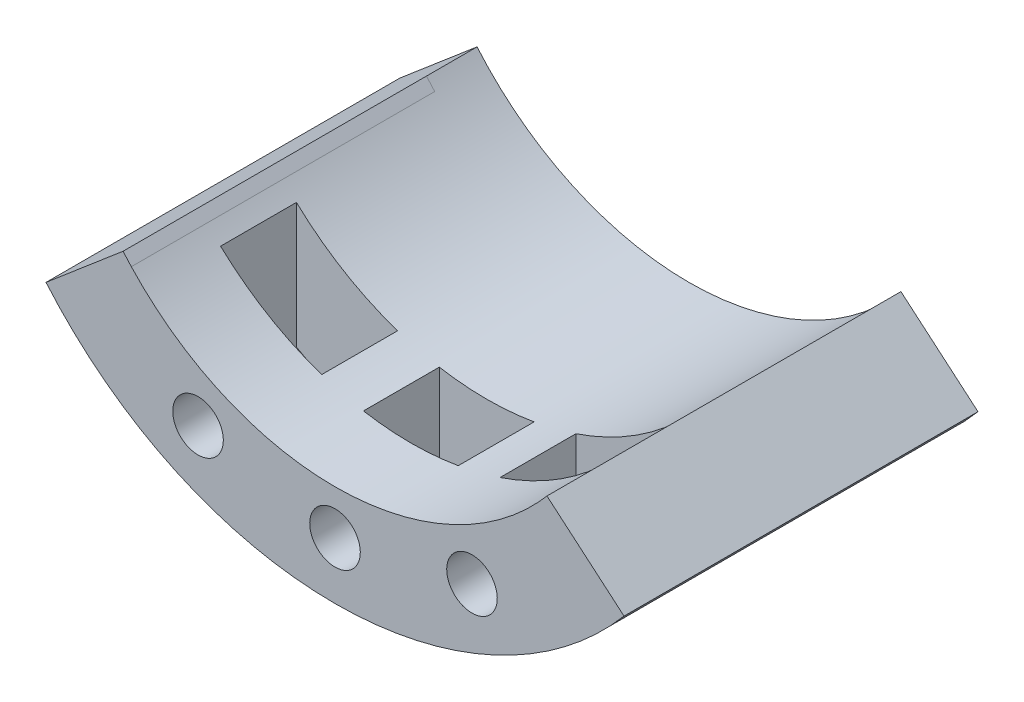
ISO-10303-21;
HEADER;
FILE_DESCRIPTION(('STEP AP214'),'2;1');
FILE_NAME('part.step','',(''),(''),'','','');
FILE_SCHEMA(('AUTOMOTIVE_DESIGN { 1 0 10303 214 1 1 1 1 }'));
ENDSEC;
DATA;
#1=APPLICATION_CONTEXT('core data for automotive mechanical design processes');
#2=APPLICATION_PROTOCOL_DEFINITION('international standard','automotive_design',2000,#1);
#3=PRODUCT_CONTEXT('',#1,'mechanical');
#4=PRODUCT('Part','Part','',(#3));
#5=PRODUCT_RELATED_PRODUCT_CATEGORY('part','',(#4));
#6=PRODUCT_DEFINITION_FORMATION('','',#4);
#7=PRODUCT_DEFINITION_CONTEXT('part definition',#1,'design');
#8=PRODUCT_DEFINITION('design','',#6,#7);
#9=PRODUCT_DEFINITION_SHAPE('','',#8);
#10=(LENGTH_UNIT() NAMED_UNIT(*) SI_UNIT(.MILLI.,.METRE.));
#11=(NAMED_UNIT(*) PLANE_ANGLE_UNIT() SI_UNIT($,.RADIAN.));
#12=(NAMED_UNIT(*) SI_UNIT($,.STERADIAN.) SOLID_ANGLE_UNIT());
#13=UNCERTAINTY_MEASURE_WITH_UNIT(LENGTH_MEASURE(1.E-05),#10,'distance_accuracy_value','');
#14=(GEOMETRIC_REPRESENTATION_CONTEXT(3) GLOBAL_UNCERTAINTY_ASSIGNED_CONTEXT((#13)) GLOBAL_UNIT_ASSIGNED_CONTEXT((#10,
#11,#12)) REPRESENTATION_CONTEXT('',''));
#15=CARTESIAN_POINT('',(0.,0.,0.));
#16=DIRECTION('',(0.,0.,1.));
#17=DIRECTION('',(1.,0.,0.));
#18=AXIS2_PLACEMENT_3D('',#15,#16,#17);
#19=CARTESIAN_POINT('',(0.,0.,4.));
#20=DIRECTION('',(0.,0.,-1.));
#21=DIRECTION('',(-1.,0.,0.));
#22=AXIS2_PLACEMENT_3D('',#19,#20,#21);
#23=CYLINDRICAL_SURFACE('',#22,30.);
#24=CARTESIAN_POINT('',(0.,0.,-6.));
#25=DIRECTION('',(0.,0.,1.));
#26=DIRECTION('',(1.,0.,0.));
#27=AXIS2_PLACEMENT_3D('',#24,#25,#26);
#28=CIRCLE('',#27,30.);
#29=CARTESIAN_POINT('',(-7.05257447191136,-29.1592385586137,-6.));
#30=VERTEX_POINT('',#29);
#31=CARTESIAN_POINT('',(-15.0525744719114,-25.9503372187639,-6.));
#32=VERTEX_POINT('',#31);
#33=EDGE_CURVE('E238',#30,#32,#28,.F.);
#34=ORIENTED_EDGE('',*,*,#33,.F.);
#35=DIRECTION('',(0.,0.,-1.));
#36=VECTOR('',#35,1.);
#37=CARTESIAN_POINT('',(-7.05257447191136,-29.1592385586137,4.));
#38=LINE('',#37,#36);
#39=CARTESIAN_POINT('',(-7.05257447191136,-29.1592385586137,-12.));
#40=VERTEX_POINT('',#39);
#41=EDGE_CURVE('E215',#40,#30,#38,.F.);
#42=ORIENTED_EDGE('',*,*,#41,.F.);
#43=CARTESIAN_POINT('',(0.,0.,-12.));
#44=DIRECTION('',(0.,0.,-1.));
#45=DIRECTION('',(-1.,0.,0.));
#46=AXIS2_PLACEMENT_3D('',#43,#44,#45);
#47=CIRCLE('',#46,30.);
#48=CARTESIAN_POINT('',(-15.0525744719114,-25.9503372187639,-12.));
#49=VERTEX_POINT('',#48);
#50=EDGE_CURVE('E218',#49,#40,#47,.F.);
#51=ORIENTED_EDGE('',*,*,#50,.F.);
#52=DIRECTION('',(0.,0.,-1.));
#53=VECTOR('',#52,1.);
#54=CARTESIAN_POINT('',(-15.0525744719114,-25.9503372187639,4.));
#55=LINE('',#54,#53);
#56=EDGE_CURVE('E220',#32,#49,#55,.T.);
#57=ORIENTED_EDGE('',*,*,#56,.F.);
#58=EDGE_LOOP('',(#34,#42,#51,#57));
#59=FACE_BOUND('',#58,.T.);
#60=CARTESIAN_POINT('',(0.,0.,-6.));
#61=DIRECTION('',(0.,0.,1.));
#62=DIRECTION('',(1.,0.,0.));
#63=AXIS2_PLACEMENT_3D('',#60,#61,#62);
#64=CIRCLE('',#63,30.);
#65=CARTESIAN_POINT('',(3.75,-29.7647022494766,-6.));
#66=VERTEX_POINT('',#65);
#67=CARTESIAN_POINT('',(-3.75,-29.7647022494766,-6.));
#68=VERTEX_POINT('',#67);
#69=EDGE_CURVE('E241',#66,#68,#64,.F.);
#70=ORIENTED_EDGE('',*,*,#69,.F.);
#71=DIRECTION('',(0.,0.,-1.));
#72=VECTOR('',#71,1.);
#73=CARTESIAN_POINT('',(3.75,-29.7647022494766,4.));
#74=LINE('',#73,#72);
#75=CARTESIAN_POINT('',(3.75,-29.7647022494766,-12.));
#76=VERTEX_POINT('',#75);
#77=EDGE_CURVE('E203',#76,#66,#74,.F.);
#78=ORIENTED_EDGE('',*,*,#77,.F.);
#79=CARTESIAN_POINT('',(0.,0.,-12.));
#80=DIRECTION('',(0.,0.,-1.));
#81=DIRECTION('',(-1.,0.,0.));
#82=AXIS2_PLACEMENT_3D('',#79,#80,#81);
#83=CIRCLE('',#82,30.);
#84=CARTESIAN_POINT('',(-3.75,-29.7647022494766,-12.));
#85=VERTEX_POINT('',#84);
#86=EDGE_CURVE('E211',#85,#76,#83,.F.);
#87=ORIENTED_EDGE('',*,*,#86,.F.);
#88=DIRECTION('',(0.,0.,-1.));
#89=VECTOR('',#88,1.);
#90=CARTESIAN_POINT('',(-3.75,-29.7647022494766,4.));
#91=LINE('',#90,#89);
#92=EDGE_CURVE('E213',#68,#85,#91,.T.);
#93=ORIENTED_EDGE('',*,*,#92,.F.);
#94=EDGE_LOOP('',(#70,#78,#87,#93));
#95=FACE_BOUND('',#94,.T.);
#96=CARTESIAN_POINT('',(0.,0.,-6.));
#97=DIRECTION('',(0.,0.,-1.));
#98=DIRECTION('',(-1.,0.,0.));
#99=AXIS2_PLACEMENT_3D('',#96,#97,#98);
#100=CIRCLE('',#99,30.);
#101=CARTESIAN_POINT('',(7.05257447191136,-29.1592385586137,-6.));
#102=VERTEX_POINT('',#101);
#103=CARTESIAN_POINT('',(15.0525744719114,-25.9503372187639,-6.));
#104=VERTEX_POINT('',#103);
#105=EDGE_CURVE('E174',#102,#104,#100,.F.);
#106=ORIENTED_EDGE('',*,*,#105,.T.);
#107=DIRECTION('',(0.,0.,-1.));
#108=VECTOR('',#107,1.);
#109=CARTESIAN_POINT('',(15.0525744719114,-25.9503372187639,4.));
#110=LINE('',#109,#108);
#111=CARTESIAN_POINT('',(15.0525744719114,-25.9503372187639,-12.));
#112=VERTEX_POINT('',#111);
#113=EDGE_CURVE('E201',#112,#104,#110,.F.);
#114=ORIENTED_EDGE('',*,*,#113,.F.);
#115=CARTESIAN_POINT('',(0.,0.,-12.));
#116=DIRECTION('',(0.,0.,-1.));
#117=DIRECTION('',(-1.,0.,0.));
#118=AXIS2_PLACEMENT_3D('',#115,#116,#117);
#119=CIRCLE('',#118,30.);
#120=CARTESIAN_POINT('',(7.05257447191135,-29.1592385586137,-12.));
#121=VERTEX_POINT('',#120);
#122=EDGE_CURVE('E200',#121,#112,#119,.F.);
#123=ORIENTED_EDGE('',*,*,#122,.F.);
#124=DIRECTION('',(0.,0.,-1.));
#125=VECTOR('',#124,1.);
#126=CARTESIAN_POINT('',(7.05257447191136,-29.1592385586137,4.));
#127=LINE('',#126,#125);
#128=EDGE_CURVE('E192',#102,#121,#127,.T.);
#129=ORIENTED_EDGE('',*,*,#128,.F.);
#130=EDGE_LOOP('',(#106,#114,#123,#129));
#131=FACE_BOUND('',#130,.T.);
#132=DIRECTION('',(0.,0.,1.));
#133=VECTOR('',#132,1.);
#134=CARTESIAN_POINT('',(22.8608633332696,-19.4262947485507,-28.));
#135=LINE('',#134,#133);
#136=CARTESIAN_POINT('',(22.8608633332696,-19.4262947485507,-28.));
#137=VERTEX_POINT('',#136);
#138=CARTESIAN_POINT('',(22.8608633332696,-19.4262947485507,0.));
#139=VERTEX_POINT('',#138);
#140=EDGE_CURVE('E482',#137,#139,#135,.T.);
#141=ORIENTED_EDGE('',*,*,#140,.T.);
#142=CARTESIAN_POINT('',(0.,0.,0.));
#143=DIRECTION('',(0.,0.,1.));
#144=DIRECTION('',(0.,-1.,0.));
#145=AXIS2_PLACEMENT_3D('',#142,#143,#144);
#146=CIRCLE('',#145,30.);
#147=CARTESIAN_POINT('',(-22.8608633332696,-19.4262947485508,0.));
#148=VERTEX_POINT('',#147);
#149=EDGE_CURVE('E226',#139,#148,#146,.F.);
#150=ORIENTED_EDGE('',*,*,#149,.T.);
#151=DIRECTION('',(0.,0.,1.));
#152=VECTOR('',#151,1.);
#153=CARTESIAN_POINT('',(-22.8608633332696,-19.4262947485508,-28.));
#154=LINE('',#153,#152);
#155=CARTESIAN_POINT('',(-22.8608633332696,-19.4262947485508,-28.));
#156=VERTEX_POINT('',#155);
#157=EDGE_CURVE('E312',#156,#148,#154,.T.);
#158=ORIENTED_EDGE('',*,*,#157,.F.);
#159=CARTESIAN_POINT('',(0.,0.,-28.));
#160=DIRECTION('',(0.,0.,-1.));
#161=DIRECTION('',(-1.,0.,0.));
#162=AXIS2_PLACEMENT_3D('',#159,#160,#161);
#163=CIRCLE('',#162,30.);
#164=EDGE_CURVE('E301',#137,#156,#163,.T.);
#165=ORIENTED_EDGE('',*,*,#164,.F.);
#166=EDGE_LOOP('',(#141,#150,#158,#165));
#167=FACE_BOUND('',#166,.T.);
#168=ADVANCED_FACE('F42',(#59,#95,#131,#167),#23,.T.);
#169=CARTESIAN_POINT('',(0.,-25.5,4.));
#170=DIRECTION('',(0.,0.,-1.));
#171=DIRECTION('',(-1.,0.,0.));
#172=AXIS2_PLACEMENT_3D('',#169,#170,#171);
#173=CYLINDRICAL_SURFACE('',#172,2.);
#174=CARTESIAN_POINT('',(0.,-25.5,-6.));
#175=DIRECTION('',(0.,0.,1.));
#176=DIRECTION('',(1.,0.,0.));
#177=AXIS2_PLACEMENT_3D('',#174,#175,#176);
#178=CIRCLE('',#177,2.);
#179=CARTESIAN_POINT('',(2.,-25.5,-6.));
#180=VERTEX_POINT('',#179);
#181=EDGE_CURVE('E186',#180,#180,#178,.T.);
#182=ORIENTED_EDGE('',*,*,#181,.F.);
#183=EDGE_LOOP('',(#182));
#184=FACE_BOUND('',#183,.T.);
#185=CARTESIAN_POINT('',(0.,-25.5,0.));
#186=DIRECTION('',(0.,0.,1.));
#187=DIRECTION('',(0.,-1.,0.));
#188=AXIS2_PLACEMENT_3D('',#185,#186,#187);
#189=CIRCLE('',#188,2.);
#190=CARTESIAN_POINT('',(0.,-27.5,0.));
#191=VERTEX_POINT('',#190);
#192=EDGE_CURVE('E235',#191,#191,#189,.F.);
#193=ORIENTED_EDGE('',*,*,#192,.F.);
#194=EDGE_LOOP('',(#193));
#195=FACE_BOUND('',#194,.T.);
#196=ADVANCED_FACE('F347',(#184,#195),#173,.F.);
#197=CARTESIAN_POINT('',(10.8348755339235,-23.2354655653591,4.));
#198=DIRECTION('',(0.,0.,-1.));
#199=DIRECTION('',(-1.,0.,0.));
#200=AXIS2_PLACEMENT_3D('',#197,#198,#199);
#201=CYLINDRICAL_SURFACE('',#200,2.);
#202=CARTESIAN_POINT('',(10.8348755339235,-23.2354655653591,-6.));
#203=DIRECTION('',(0.,0.,1.));
#204=DIRECTION('',(1.,0.,0.));
#205=AXIS2_PLACEMENT_3D('',#202,#203,#204);
#206=CIRCLE('',#205,2.);
#207=CARTESIAN_POINT('',(12.8348755339235,-23.2354655653591,-6.));
#208=VERTEX_POINT('',#207);
#209=EDGE_CURVE('E185',#208,#208,#206,.T.);
#210=ORIENTED_EDGE('',*,*,#209,.F.);
#211=EDGE_LOOP('',(#210));
#212=FACE_BOUND('',#211,.T.);
#213=CARTESIAN_POINT('',(10.8348755339235,-23.2354655653591,0.));
#214=DIRECTION('',(0.,0.,1.));
#215=DIRECTION('',(0.,-1.,0.));
#216=AXIS2_PLACEMENT_3D('',#213,#214,#215);
#217=CIRCLE('',#216,2.);
#218=CARTESIAN_POINT('',(10.8348755339235,-25.2354655653591,0.));
#219=VERTEX_POINT('',#218);
#220=EDGE_CURVE('E232',#219,#219,#217,.F.);
#221=ORIENTED_EDGE('',*,*,#220,.F.);
#222=EDGE_LOOP('',(#221));
#223=FACE_BOUND('',#222,.T.);
#224=ADVANCED_FACE('F342',(#212,#223),#201,.F.);
#225=CARTESIAN_POINT('',(-10.8348755339235,-23.2354655653591,4.));
#226=DIRECTION('',(0.,0.,-1.));
#227=DIRECTION('',(-1.,0.,0.));
#228=AXIS2_PLACEMENT_3D('',#225,#226,#227);
#229=CYLINDRICAL_SURFACE('',#228,2.);
#230=CARTESIAN_POINT('',(-10.8348755339235,-23.2354655653591,-6.));
#231=DIRECTION('',(0.,0.,1.));
#232=DIRECTION('',(1.,0.,0.));
#233=AXIS2_PLACEMENT_3D('',#230,#231,#232);
#234=CIRCLE('',#233,2.);
#235=CARTESIAN_POINT('',(-8.83487553392354,-23.2354655653591,-6.));
#236=VERTEX_POINT('',#235);
#237=EDGE_CURVE('E240',#236,#236,#234,.T.);
#238=ORIENTED_EDGE('',*,*,#237,.F.);
#239=EDGE_LOOP('',(#238));
#240=FACE_BOUND('',#239,.T.);
#241=CARTESIAN_POINT('',(-10.8348755339235,-23.2354655653591,0.));
#242=DIRECTION('',(0.,0.,1.));
#243=DIRECTION('',(0.,-1.,0.));
#244=AXIS2_PLACEMENT_3D('',#241,#242,#243);
#245=CIRCLE('',#244,2.);
#246=CARTESIAN_POINT('',(-10.8348755339235,-25.2354655653591,0.));
#247=VERTEX_POINT('',#246);
#248=EDGE_CURVE('E225',#247,#247,#245,.F.);
#249=ORIENTED_EDGE('',*,*,#248,.F.);
#250=EDGE_LOOP('',(#249));
#251=FACE_BOUND('',#250,.T.);
#252=ADVANCED_FACE('F346',(#240,#251),#229,.F.);
#253=CARTESIAN_POINT('',(-16.7646331110644,-14.2459494822706,-28.));
#254=DIRECTION('',(0.647543158285025,-0.762028777775652,0.));
#255=DIRECTION('',(0.762028777775653,0.647543158285025,0.));
#256=AXIS2_PLACEMENT_3D('',#253,#254,#255);
#257=PLANE('',#256);
#258=DIRECTION('',(-0.762028777775653,-0.647543158285025,0.));
#259=VECTOR('',#258,1.);
#260=CARTESIAN_POINT('',(-16.7646331110644,-14.2459494822706,0.));
#261=LINE('',#260,#259);
#262=CARTESIAN_POINT('',(-16.7646331110644,-14.2459494822706,0.));
#263=VERTEX_POINT('',#262);
#264=EDGE_CURVE('E222',#263,#148,#261,.T.);
#265=ORIENTED_EDGE('',*,*,#264,.F.);
#266=DIRECTION('',(0.,0.,1.));
#267=VECTOR('',#266,1.);
#268=CARTESIAN_POINT('',(-16.7646331110644,-14.2459494822706,-24.));
#269=LINE('',#268,#267);
#270=CARTESIAN_POINT('',(-16.7646331110644,-14.2459494822706,-24.));
#271=VERTEX_POINT('',#270);
#272=EDGE_CURVE('E299',#271,#263,#269,.T.);
#273=ORIENTED_EDGE('',*,*,#272,.F.);
#274=DIRECTION('',(0.,0.,1.));
#275=VECTOR('',#274,1.);
#276=CARTESIAN_POINT('',(-16.7646331110644,-14.2459494822706,-28.));
#277=LINE('',#276,#275);
#278=CARTESIAN_POINT('',(-16.7646331110644,-14.2459494822706,-28.));
#279=VERTEX_POINT('',#278);
#280=EDGE_CURVE('E304',#279,#271,#277,.T.);
#281=ORIENTED_EDGE('',*,*,#280,.F.);
#282=DIRECTION('',(0.762028777775653,0.647543158285025,0.));
#283=VECTOR('',#282,1.);
#284=CARTESIAN_POINT('',(-16.7646331110644,-14.2459494822706,-28.));
#285=LINE('',#284,#283);
#286=EDGE_CURVE('E64',#156,#279,#285,.T.);
#287=ORIENTED_EDGE('',*,*,#286,.F.);
#288=ORIENTED_EDGE('',*,*,#157,.T.);
#289=EDGE_LOOP('',(#265,#273,#281,#287,#288));
#290=FACE_BOUND('',#289,.T.);
#291=ADVANCED_FACE('F350',(#290),#257,.F.);
#292=CARTESIAN_POINT('',(16.7646331110644,-14.2459494822706,-28.));
#293=DIRECTION('',(-0.647543158285025,-0.762028777775652,0.));
#294=DIRECTION('',(0.762028777775653,-0.647543158285025,0.));
#295=AXIS2_PLACEMENT_3D('',#292,#293,#294);
#296=PLANE('',#295);
#297=DIRECTION('',(-0.762028777775653,0.647543158285025,0.));
#298=VECTOR('',#297,1.);
#299=CARTESIAN_POINT('',(16.7646331110644,-14.2459494822706,0.));
#300=LINE('',#299,#298);
#301=CARTESIAN_POINT('',(16.7646331110644,-14.2459494822706,0.));
#302=VERTEX_POINT('',#301);
#303=EDGE_CURVE('E223',#139,#302,#300,.T.);
#304=ORIENTED_EDGE('',*,*,#303,.F.);
#305=ORIENTED_EDGE('',*,*,#140,.F.);
#306=DIRECTION('',(0.762028777775653,-0.647543158285025,0.));
#307=VECTOR('',#306,1.);
#308=CARTESIAN_POINT('',(16.7646331110644,-14.2459494822706,-28.));
#309=LINE('',#308,#307);
#310=CARTESIAN_POINT('',(16.7646331110644,-14.2459494822706,-28.));
#311=VERTEX_POINT('',#310);
#312=EDGE_CURVE('E298',#311,#137,#309,.T.);
#313=ORIENTED_EDGE('',*,*,#312,.F.);
#314=DIRECTION('',(0.,0.,1.));
#315=VECTOR('',#314,1.);
#316=CARTESIAN_POINT('',(16.7646331110644,-14.2459494822706,-28.));
#317=LINE('',#316,#315);
#318=CARTESIAN_POINT('',(16.7646331110644,-14.2459494822706,-24.));
#319=VERTEX_POINT('',#318);
#320=EDGE_CURVE('E309',#311,#319,#317,.T.);
#321=ORIENTED_EDGE('',*,*,#320,.T.);
#322=DIRECTION('',(0.,0.,1.));
#323=VECTOR('',#322,1.);
#324=CARTESIAN_POINT('',(16.7646331110644,-14.2459494822706,-24.));
#325=LINE('',#324,#323);
#326=EDGE_CURVE('E56',#319,#302,#325,.T.);
#327=ORIENTED_EDGE('',*,*,#326,.T.);
#328=EDGE_LOOP('',(#304,#305,#313,#321,#327));
#329=FACE_BOUND('',#328,.T.);
#330=ADVANCED_FACE('F341',(#329),#296,.F.);
#331=CARTESIAN_POINT('',(0.,0.,-28.));
#332=DIRECTION('',(0.,0.,1.));
#333=DIRECTION('',(1.,0.,0.));
#334=AXIS2_PLACEMENT_3D('',#331,#332,#333);
#335=CYLINDRICAL_SURFACE('',#334,22.);
#336=CARTESIAN_POINT('',(0.,0.,0.));
#337=DIRECTION('',(0.,0.,1.));
#338=DIRECTION('',(-1.,0.,0.));
#339=AXIS2_PLACEMENT_3D('',#336,#337,#338);
#340=CIRCLE('',#339,22.);
#341=CARTESIAN_POINT('',(-16.1120263584917,-14.980073652131,0.));
#342=VERTEX_POINT('',#341);
#343=CARTESIAN_POINT('',(16.1120263584917,-14.980073652131,0.));
#344=VERTEX_POINT('',#343);
#345=EDGE_CURVE('E305',#342,#344,#340,.T.);
#346=ORIENTED_EDGE('',*,*,#345,.T.);
#347=DIRECTION('',(0.,0.,1.));
#348=VECTOR('',#347,1.);
#349=CARTESIAN_POINT('',(16.1120263584917,-14.980073652131,-24.));
#350=LINE('',#349,#348);
#351=CARTESIAN_POINT('',(16.1120263584917,-14.980073652131,-24.));
#352=VERTEX_POINT('',#351);
#353=EDGE_CURVE('E253',#352,#344,#350,.T.);
#354=ORIENTED_EDGE('',*,*,#353,.F.);
#355=CARTESIAN_POINT('',(0.,0.,-24.));
#356=DIRECTION('',(0.,0.,1.));
#357=DIRECTION('',(0.732364834476895,-0.680912438733227,0.));
#358=AXIS2_PLACEMENT_3D('',#355,#356,#357);
#359=CIRCLE('',#358,22.);
#360=EDGE_CURVE('E258',#352,#319,#359,.T.);
#361=ORIENTED_EDGE('',*,*,#360,.T.);
#362=ORIENTED_EDGE('',*,*,#320,.F.);
#363=CARTESIAN_POINT('',(0.,0.,-28.));
#364=DIRECTION('',(0.,0.,1.));
#365=DIRECTION('',(-1.,0.,0.));
#366=AXIS2_PLACEMENT_3D('',#363,#364,#365);
#367=CIRCLE('',#366,22.);
#368=EDGE_CURVE('E291',#279,#311,#367,.T.);
#369=ORIENTED_EDGE('',*,*,#368,.F.);
#370=ORIENTED_EDGE('',*,*,#280,.T.);
#371=CARTESIAN_POINT('',(-16.1120263584917,-14.980073652131,-24.));
#372=DIRECTION('',(-0.664393374210856,0.747383063967008,0.));
#373=VECTOR('',#372,1.);
#374=LINE('',#371,#373);
#375=CARTESIAN_POINT('',(-16.1120263584917,-14.980073652131,-24.));
#376=VERTEX_POINT('',#375);
#377=EDGE_CURVE('E308',#376,#271,#374,.T.);
#378=ORIENTED_EDGE('',*,*,#377,.F.);
#379=DIRECTION('',(0.,0.,1.));
#380=VECTOR('',#379,1.);
#381=CARTESIAN_POINT('',(-16.1120263584917,-14.980073652131,-24.));
#382=LINE('',#381,#380);
#383=EDGE_CURVE('E256',#376,#342,#382,.T.);
#384=ORIENTED_EDGE('',*,*,#383,.T.);
#385=EDGE_LOOP('',(#346,#354,#361,#362,#369,#370,#378,#384));
#386=FACE_BOUND('',#385,.T.);
#387=DIRECTION('',(0.,0.,1.));
#388=VECTOR('',#387,1.);
#389=CARTESIAN_POINT('',(-7.05257447191136,-20.8389345533342,-28.));
#390=LINE('',#389,#388);
#391=CARTESIAN_POINT('',(-7.05257447191136,-20.8389345533342,-12.));
#392=VERTEX_POINT('',#391);
#393=CARTESIAN_POINT('',(-7.05257447191136,-20.8389345533342,-6.));
#394=VERTEX_POINT('',#393);
#395=EDGE_CURVE('E441',#392,#394,#390,.T.);
#396=ORIENTED_EDGE('',*,*,#395,.T.);
#397=CARTESIAN_POINT('',(0.,0.,-6.));
#398=DIRECTION('',(0.,0.,1.));
#399=DIRECTION('',(1.,0.,0.));
#400=AXIS2_PLACEMENT_3D('',#397,#398,#399);
#401=CIRCLE('',#400,22.);
#402=CARTESIAN_POINT('',(-15.0525744719114,-16.0443136895151,-6.));
#403=VERTEX_POINT('',#402);
#404=EDGE_CURVE('E471',#394,#403,#401,.F.);
#405=ORIENTED_EDGE('',*,*,#404,.T.);
#406=DIRECTION('',(0.,0.,1.));
#407=VECTOR('',#406,1.);
#408=CARTESIAN_POINT('',(-15.0525744719114,-16.0443136895151,-28.));
#409=LINE('',#408,#407);
#410=CARTESIAN_POINT('',(-15.0525744719114,-16.0443136895151,-12.));
#411=VERTEX_POINT('',#410);
#412=EDGE_CURVE('E11',#403,#411,#409,.F.);
#413=ORIENTED_EDGE('',*,*,#412,.T.);
#414=CARTESIAN_POINT('',(0.,0.,-12.));
#415=DIRECTION('',(0.,0.,-1.));
#416=DIRECTION('',(-1.,0.,0.));
#417=AXIS2_PLACEMENT_3D('',#414,#415,#416);
#418=CIRCLE('',#417,22.);
#419=EDGE_CURVE('E49',#411,#392,#418,.F.);
#420=ORIENTED_EDGE('',*,*,#419,.T.);
#421=EDGE_LOOP('',(#396,#405,#413,#420));
#422=FACE_BOUND('',#421,.T.);
#423=DIRECTION('',(0.,0.,1.));
#424=VECTOR('',#423,1.);
#425=CARTESIAN_POINT('',(3.75,-21.6780418857424,-28.));
#426=LINE('',#425,#424);
#427=CARTESIAN_POINT('',(3.75,-21.6780418857424,-12.));
#428=VERTEX_POINT('',#427);
#429=CARTESIAN_POINT('',(3.75,-21.6780418857424,-6.));
#430=VERTEX_POINT('',#429);
#431=EDGE_CURVE('E413',#428,#430,#426,.T.);
#432=ORIENTED_EDGE('',*,*,#431,.T.);
#433=CARTESIAN_POINT('',(0.,0.,-6.));
#434=DIRECTION('',(0.,0.,1.));
#435=DIRECTION('',(1.,0.,0.));
#436=AXIS2_PLACEMENT_3D('',#433,#434,#435);
#437=CIRCLE('',#436,22.);
#438=CARTESIAN_POINT('',(-3.75,-21.6780418857424,-6.));
#439=VERTEX_POINT('',#438);
#440=EDGE_CURVE('E432',#430,#439,#437,.F.);
#441=ORIENTED_EDGE('',*,*,#440,.T.);
#442=DIRECTION('',(0.,0.,1.));
#443=VECTOR('',#442,1.);
#444=CARTESIAN_POINT('',(-3.75,-21.6780418857424,-28.));
#445=LINE('',#444,#443);
#446=CARTESIAN_POINT('',(-3.75,-21.6780418857424,-12.));
#447=VERTEX_POINT('',#446);
#448=EDGE_CURVE('E399',#439,#447,#445,.F.);
#449=ORIENTED_EDGE('',*,*,#448,.T.);
#450=CARTESIAN_POINT('',(0.,0.,-12.));
#451=DIRECTION('',(0.,0.,-1.));
#452=DIRECTION('',(-1.,0.,0.));
#453=AXIS2_PLACEMENT_3D('',#450,#451,#452);
#454=CIRCLE('',#453,22.);
#455=EDGE_CURVE('E438',#447,#428,#454,.F.);
#456=ORIENTED_EDGE('',*,*,#455,.T.);
#457=EDGE_LOOP('',(#432,#441,#449,#456));
#458=FACE_BOUND('',#457,.T.);
#459=DIRECTION('',(0.,0.,1.));
#460=VECTOR('',#459,1.);
#461=CARTESIAN_POINT('',(15.0525744719114,-16.0443136895151,-28.));
#462=LINE('',#461,#460);
#463=CARTESIAN_POINT('',(15.0525744719114,-16.0443136895151,-12.));
#464=VERTEX_POINT('',#463);
#465=CARTESIAN_POINT('',(15.0525744719114,-16.0443136895151,-6.));
#466=VERTEX_POINT('',#465);
#467=EDGE_CURVE('E428',#464,#466,#462,.T.);
#468=ORIENTED_EDGE('',*,*,#467,.T.);
#469=CARTESIAN_POINT('',(0.,0.,-6.));
#470=DIRECTION('',(0.,0.,-1.));
#471=DIRECTION('',(-1.,0.,0.));
#472=AXIS2_PLACEMENT_3D('',#469,#470,#471);
#473=CIRCLE('',#472,22.);
#474=CARTESIAN_POINT('',(7.05257447191136,-20.8389345533342,-6.));
#475=VERTEX_POINT('',#474);
#476=EDGE_CURVE('E429',#475,#466,#473,.F.);
#477=ORIENTED_EDGE('',*,*,#476,.F.);
#478=DIRECTION('',(0.,0.,1.));
#479=VECTOR('',#478,1.);
#480=CARTESIAN_POINT('',(7.05257447191136,-20.8389345533342,-28.));
#481=LINE('',#480,#479);
#482=CARTESIAN_POINT('',(7.05257447191135,-20.8389345533342,-12.));
#483=VERTEX_POINT('',#482);
#484=EDGE_CURVE('E195',#475,#483,#481,.F.);
#485=ORIENTED_EDGE('',*,*,#484,.T.);
#486=CARTESIAN_POINT('',(0.,0.,-12.));
#487=DIRECTION('',(0.,0.,-1.));
#488=DIRECTION('',(-1.,0.,0.));
#489=AXIS2_PLACEMENT_3D('',#486,#487,#488);
#490=CIRCLE('',#489,22.);
#491=EDGE_CURVE('E425',#483,#464,#490,.F.);
#492=ORIENTED_EDGE('',*,*,#491,.T.);
#493=EDGE_LOOP('',(#468,#477,#485,#492));
#494=FACE_BOUND('',#493,.T.);
#495=ADVANCED_FACE('F331',(#386,#422,#458,#494),#335,.F.);
#496=CARTESIAN_POINT('',(0.,0.,-28.));
#497=DIRECTION('',(0.,0.,-1.));
#498=DIRECTION('',(-1.,0.,0.));
#499=AXIS2_PLACEMENT_3D('',#496,#497,#498);
#500=PLANE('',#499);
#501=ORIENTED_EDGE('',*,*,#368,.T.);
#502=ORIENTED_EDGE('',*,*,#312,.T.);
#503=ORIENTED_EDGE('',*,*,#164,.T.);
#504=ORIENTED_EDGE('',*,*,#286,.T.);
#505=EDGE_LOOP('',(#501,#502,#503,#504));
#506=FACE_BOUND('',#505,.T.);
#507=ADVANCED_FACE('F282',(#506),#500,.T.);
#508=CARTESIAN_POINT('',(-16.7646331110644,-14.2459494822706,-24.));
#509=DIRECTION('',(0.747383063967008,0.664393374210856,0.));
#510=DIRECTION('',(-0.664393374210856,0.747383063967008,0.));
#511=AXIS2_PLACEMENT_3D('',#508,#509,#510);
#512=PLANE('',#511);
#513=DIRECTION('',(-0.664393374210856,0.747383063967008,0.));
#514=VECTOR('',#513,1.);
#515=CARTESIAN_POINT('',(-16.7646331110644,-14.2459494822706,0.));
#516=LINE('',#515,#514);
#517=EDGE_CURVE('E472',#342,#263,#516,.T.);
#518=ORIENTED_EDGE('',*,*,#517,.F.);
#519=ORIENTED_EDGE('',*,*,#383,.F.);
#520=ORIENTED_EDGE('',*,*,#377,.T.);
#521=ORIENTED_EDGE('',*,*,#272,.T.);
#522=EDGE_LOOP('',(#518,#519,#520,#521));
#523=FACE_BOUND('',#522,.T.);
#524=ADVANCED_FACE('F277',(#523),#512,.T.);
#525=CARTESIAN_POINT('',(16.7646331110644,-14.2459494822706,-24.));
#526=DIRECTION('',(-0.747383063967008,0.664393374210856,0.));
#527=DIRECTION('',(-0.664393374210856,-0.747383063967008,0.));
#528=AXIS2_PLACEMENT_3D('',#525,#526,#527);
#529=PLANE('',#528);
#530=DIRECTION('',(-0.664393374210856,-0.747383063967008,0.));
#531=VECTOR('',#530,1.);
#532=CARTESIAN_POINT('',(16.7646331110644,-14.2459494822706,0.));
#533=LINE('',#532,#531);
#534=EDGE_CURVE('E474',#302,#344,#533,.T.);
#535=ORIENTED_EDGE('',*,*,#534,.F.);
#536=ORIENTED_EDGE('',*,*,#326,.F.);
#537=ORIENTED_EDGE('',*,*,#360,.F.);
#538=ORIENTED_EDGE('',*,*,#353,.T.);
#539=EDGE_LOOP('',(#535,#536,#537,#538));
#540=FACE_BOUND('',#539,.T.);
#541=ADVANCED_FACE('F266',(#540),#529,.T.);
#542=CARTESIAN_POINT('',(0.,-35.,-6.));
#543=DIRECTION('',(0.,0.,1.));
#544=DIRECTION('',(1.,0.,0.));
#545=AXIS2_PLACEMENT_3D('',#542,#543,#544);
#546=PLANE('',#545);
#547=ORIENTED_EDGE('',*,*,#237,.T.);
#548=EDGE_LOOP('',(#547));
#549=FACE_BOUND('',#548,.T.);
#550=ORIENTED_EDGE('',*,*,#33,.T.);
#551=DIRECTION('',(0.,1.,0.));
#552=VECTOR('',#551,1.);
#553=CARTESIAN_POINT('',(-15.0525744719114,-40.,-6.));
#554=LINE('',#553,#552);
#555=EDGE_CURVE('E205',#32,#403,#554,.T.);
#556=ORIENTED_EDGE('',*,*,#555,.T.);
#557=ORIENTED_EDGE('',*,*,#404,.F.);
#558=DIRECTION('',(0.,1.,0.));
#559=VECTOR('',#558,1.);
#560=CARTESIAN_POINT('',(-7.05257447191136,-40.,-6.));
#561=LINE('',#560,#559);
#562=EDGE_CURVE('E400',#30,#394,#561,.T.);
#563=ORIENTED_EDGE('',*,*,#562,.F.);
#564=EDGE_LOOP('',(#550,#556,#557,#563));
#565=FACE_BOUND('',#564,.T.);
#566=ADVANCED_FACE('F276',(#549,#565),#546,.F.);
#567=CARTESIAN_POINT('',(0.,-35.,-6.));
#568=DIRECTION('',(0.,0.,1.));
#569=DIRECTION('',(1.,0.,0.));
#570=AXIS2_PLACEMENT_3D('',#567,#568,#569);
#571=PLANE('',#570);
#572=ORIENTED_EDGE('',*,*,#181,.T.);
#573=EDGE_LOOP('',(#572));
#574=FACE_BOUND('',#573,.T.);
#575=ORIENTED_EDGE('',*,*,#69,.T.);
#576=DIRECTION('',(0.,1.,0.));
#577=VECTOR('',#576,1.);
#578=CARTESIAN_POINT('',(-3.75,-40.,-6.));
#579=LINE('',#578,#577);
#580=EDGE_CURVE('E387',#68,#439,#579,.T.);
#581=ORIENTED_EDGE('',*,*,#580,.T.);
#582=ORIENTED_EDGE('',*,*,#440,.F.);
#583=DIRECTION('',(0.,1.,0.));
#584=VECTOR('',#583,1.);
#585=CARTESIAN_POINT('',(3.75,-40.,-6.));
#586=LINE('',#585,#584);
#587=EDGE_CURVE('E389',#66,#430,#586,.T.);
#588=ORIENTED_EDGE('',*,*,#587,.F.);
#589=EDGE_LOOP('',(#575,#581,#582,#588));
#590=FACE_BOUND('',#589,.T.);
#591=ADVANCED_FACE('F373',(#574,#590),#571,.F.);
#592=CARTESIAN_POINT('',(0.,-35.,-6.));
#593=DIRECTION('',(0.,0.,-1.));
#594=DIRECTION('',(-1.,0.,0.));
#595=AXIS2_PLACEMENT_3D('',#592,#593,#594);
#596=PLANE('',#595);
#597=ORIENTED_EDGE('',*,*,#105,.F.);
#598=DIRECTION('',(0.,1.,0.));
#599=VECTOR('',#598,1.);
#600=CARTESIAN_POINT('',(7.05257447191136,-40.,-6.));
#601=LINE('',#600,#599);
#602=EDGE_CURVE('E178',#102,#475,#601,.T.);
#603=ORIENTED_EDGE('',*,*,#602,.T.);
#604=ORIENTED_EDGE('',*,*,#476,.T.);
#605=DIRECTION('',(0.,1.,0.));
#606=VECTOR('',#605,1.);
#607=CARTESIAN_POINT('',(15.0525744719114,-40.,-6.));
#608=LINE('',#607,#606);
#609=EDGE_CURVE('E180',#104,#466,#608,.T.);
#610=ORIENTED_EDGE('',*,*,#609,.F.);
#611=EDGE_LOOP('',(#597,#603,#604,#610));
#612=FACE_BOUND('',#611,.T.);
#613=ORIENTED_EDGE('',*,*,#209,.T.);
#614=EDGE_LOOP('',(#613));
#615=FACE_BOUND('',#614,.T.);
#616=ADVANCED_FACE('F176',(#612,#615),#596,.T.);
#617=CARTESIAN_POINT('',(36.,20.,0.));
#618=DIRECTION('',(0.,0.,1.));
#619=DIRECTION('',(0.,-1.,0.));
#620=AXIS2_PLACEMENT_3D('',#617,#618,#619);
#621=PLANE('',#620);
#622=ORIENTED_EDGE('',*,*,#303,.T.);
#623=ORIENTED_EDGE('',*,*,#534,.T.);
#624=ORIENTED_EDGE('',*,*,#345,.F.);
#625=ORIENTED_EDGE('',*,*,#517,.T.);
#626=ORIENTED_EDGE('',*,*,#264,.T.);
#627=ORIENTED_EDGE('',*,*,#149,.F.);
#628=EDGE_LOOP('',(#622,#623,#624,#625,#626,#627));
#629=FACE_BOUND('',#628,.T.);
#630=ORIENTED_EDGE('',*,*,#248,.T.);
#631=EDGE_LOOP('',(#630));
#632=FACE_BOUND('',#631,.T.);
#633=ORIENTED_EDGE('',*,*,#220,.T.);
#634=EDGE_LOOP('',(#633));
#635=FACE_BOUND('',#634,.T.);
#636=ORIENTED_EDGE('',*,*,#192,.T.);
#637=EDGE_LOOP('',(#636));
#638=FACE_BOUND('',#637,.T.);
#639=ADVANCED_FACE('F362',(#629,#632,#635,#638),#621,.T.);
#640=CARTESIAN_POINT('',(15.0525744719114,-40.,-12.));
#641=DIRECTION('',(1.,0.,0.));
#642=DIRECTION('',(0.,0.,-1.));
#643=AXIS2_PLACEMENT_3D('',#640,#641,#642);
#644=PLANE('',#643);
#645=ORIENTED_EDGE('',*,*,#113,.T.);
#646=ORIENTED_EDGE('',*,*,#609,.T.);
#647=ORIENTED_EDGE('',*,*,#467,.F.);
#648=DIRECTION('',(0.,1.,0.));
#649=VECTOR('',#648,1.);
#650=CARTESIAN_POINT('',(15.0525744719114,-40.,-12.));
#651=LINE('',#650,#649);
#652=EDGE_CURVE('E419',#112,#464,#651,.T.);
#653=ORIENTED_EDGE('',*,*,#652,.F.);
#654=EDGE_LOOP('',(#645,#646,#647,#653));
#655=FACE_BOUND('',#654,.T.);
#656=ADVANCED_FACE('F364',(#655),#644,.F.);
#657=CARTESIAN_POINT('',(7.05257447191136,-40.,-12.));
#658=DIRECTION('',(-1.,0.,0.));
#659=DIRECTION('',(0.,0.,1.));
#660=AXIS2_PLACEMENT_3D('',#657,#658,#659);
#661=PLANE('',#660);
#662=ORIENTED_EDGE('',*,*,#128,.T.);
#663=DIRECTION('',(0.,1.,0.));
#664=VECTOR('',#663,1.);
#665=CARTESIAN_POINT('',(7.05257447191136,-40.,-12.));
#666=LINE('',#665,#664);
#667=EDGE_CURVE('E196',#121,#483,#666,.T.);
#668=ORIENTED_EDGE('',*,*,#667,.T.);
#669=ORIENTED_EDGE('',*,*,#484,.F.);
#670=ORIENTED_EDGE('',*,*,#602,.F.);
#671=EDGE_LOOP('',(#662,#668,#669,#670));
#672=FACE_BOUND('',#671,.T.);
#673=ADVANCED_FACE('F190',(#672),#661,.F.);
#674=CARTESIAN_POINT('',(7.55257447191136,-40.,-12.));
#675=DIRECTION('',(0.,0.,-1.));
#676=DIRECTION('',(-1.,0.,0.));
#677=AXIS2_PLACEMENT_3D('',#674,#675,#676);
#678=PLANE('',#677);
#679=ORIENTED_EDGE('',*,*,#122,.T.);
#680=ORIENTED_EDGE('',*,*,#652,.T.);
#681=ORIENTED_EDGE('',*,*,#491,.F.);
#682=ORIENTED_EDGE('',*,*,#667,.F.);
#683=EDGE_LOOP('',(#679,#680,#681,#682));
#684=FACE_BOUND('',#683,.T.);
#685=ADVANCED_FACE('F424',(#684),#678,.F.);
#686=CARTESIAN_POINT('',(-3.75,-40.,-12.));
#687=DIRECTION('',(-1.,0.,0.));
#688=DIRECTION('',(0.,0.,1.));
#689=AXIS2_PLACEMENT_3D('',#686,#687,#688);
#690=PLANE('',#689);
#691=ORIENTED_EDGE('',*,*,#92,.T.);
#692=DIRECTION('',(0.,1.,0.));
#693=VECTOR('',#692,1.);
#694=CARTESIAN_POINT('',(-3.75,-40.,-12.));
#695=LINE('',#694,#693);
#696=EDGE_CURVE('E401',#85,#447,#695,.T.);
#697=ORIENTED_EDGE('',*,*,#696,.T.);
#698=ORIENTED_EDGE('',*,*,#448,.F.);
#699=ORIENTED_EDGE('',*,*,#580,.F.);
#700=EDGE_LOOP('',(#691,#697,#698,#699));
#701=FACE_BOUND('',#700,.T.);
#702=ADVANCED_FACE('F395',(#701),#690,.F.);
#703=CARTESIAN_POINT('',(3.75,-40.,-12.));
#704=DIRECTION('',(0.,0.,-1.));
#705=DIRECTION('',(-1.,0.,0.));
#706=AXIS2_PLACEMENT_3D('',#703,#704,#705);
#707=PLANE('',#706);
#708=ORIENTED_EDGE('',*,*,#86,.T.);
#709=DIRECTION('',(0.,1.,0.));
#710=VECTOR('',#709,1.);
#711=CARTESIAN_POINT('',(3.75,-40.,-12.));
#712=LINE('',#711,#710);
#713=EDGE_CURVE('E408',#76,#428,#712,.T.);
#714=ORIENTED_EDGE('',*,*,#713,.T.);
#715=ORIENTED_EDGE('',*,*,#455,.F.);
#716=ORIENTED_EDGE('',*,*,#696,.F.);
#717=EDGE_LOOP('',(#708,#714,#715,#716));
#718=FACE_BOUND('',#717,.T.);
#719=ADVANCED_FACE('F407',(#718),#707,.F.);
#720=CARTESIAN_POINT('',(3.75,-40.,-6.));
#721=DIRECTION('',(1.,0.,0.));
#722=DIRECTION('',(0.,0.,-1.));
#723=AXIS2_PLACEMENT_3D('',#720,#721,#722);
#724=PLANE('',#723);
#725=ORIENTED_EDGE('',*,*,#77,.T.);
#726=ORIENTED_EDGE('',*,*,#587,.T.);
#727=ORIENTED_EDGE('',*,*,#431,.F.);
#728=ORIENTED_EDGE('',*,*,#713,.F.);
#729=EDGE_LOOP('',(#725,#726,#727,#728));
#730=FACE_BOUND('',#729,.T.);
#731=ADVANCED_FACE('F411',(#730),#724,.F.);
#732=CARTESIAN_POINT('',(-15.0525744719114,-40.,-12.));
#733=DIRECTION('',(-1.,0.,0.));
#734=DIRECTION('',(0.,0.,1.));
#735=AXIS2_PLACEMENT_3D('',#732,#733,#734);
#736=PLANE('',#735);
#737=ORIENTED_EDGE('',*,*,#56,.T.);
#738=DIRECTION('',(0.,1.,0.));
#739=VECTOR('',#738,1.);
#740=CARTESIAN_POINT('',(-15.0525744719114,-40.,-12.));
#741=LINE('',#740,#739);
#742=EDGE_CURVE('E452',#49,#411,#741,.T.);
#743=ORIENTED_EDGE('',*,*,#742,.T.);
#744=ORIENTED_EDGE('',*,*,#412,.F.);
#745=ORIENTED_EDGE('',*,*,#555,.F.);
#746=EDGE_LOOP('',(#737,#743,#744,#745));
#747=FACE_BOUND('',#746,.T.);
#748=ADVANCED_FACE('F457',(#747),#736,.F.);
#749=CARTESIAN_POINT('',(-14.5525744719114,-40.,-12.));
#750=DIRECTION('',(0.,0.,-1.));
#751=DIRECTION('',(-1.,0.,0.));
#752=AXIS2_PLACEMENT_3D('',#749,#750,#751);
#753=PLANE('',#752);
#754=ORIENTED_EDGE('',*,*,#50,.T.);
#755=DIRECTION('',(0.,1.,0.));
#756=VECTOR('',#755,1.);
#757=CARTESIAN_POINT('',(-7.05257447191136,-40.,-12.));
#758=LINE('',#757,#756);
#759=EDGE_CURVE('E455',#40,#392,#758,.T.);
#760=ORIENTED_EDGE('',*,*,#759,.T.);
#761=ORIENTED_EDGE('',*,*,#419,.F.);
#762=ORIENTED_EDGE('',*,*,#742,.F.);
#763=EDGE_LOOP('',(#754,#760,#761,#762));
#764=FACE_BOUND('',#763,.T.);
#765=ADVANCED_FACE('F451',(#764),#753,.F.);
#766=CARTESIAN_POINT('',(-7.05257447191136,-40.,-12.));
#767=DIRECTION('',(1.,0.,0.));
#768=DIRECTION('',(0.,0.,-1.));
#769=AXIS2_PLACEMENT_3D('',#766,#767,#768);
#770=PLANE('',#769);
#771=ORIENTED_EDGE('',*,*,#41,.T.);
#772=ORIENTED_EDGE('',*,*,#562,.T.);
#773=ORIENTED_EDGE('',*,*,#395,.F.);
#774=ORIENTED_EDGE('',*,*,#759,.F.);
#775=EDGE_LOOP('',(#771,#772,#773,#774));
#776=FACE_BOUND('',#775,.T.);
#777=ADVANCED_FACE('F468',(#776),#770,.F.);
#778=CLOSED_SHELL('',(#168,#196,#224,#252,#291,#330,#495,#507,#524,#541,#566,#591,#616,#639,
#656,#673,#685,#702,#719,#731,#748,#765,#777));
#779=MANIFOLD_SOLID_BREP('B2',#778);
#780=ADVANCED_BREP_SHAPE_REPRESENTATION('',(#18,#779),#14);
#781=SHAPE_DEFINITION_REPRESENTATION(#9,#780);
ENDSEC;
END-ISO-10303-21;
